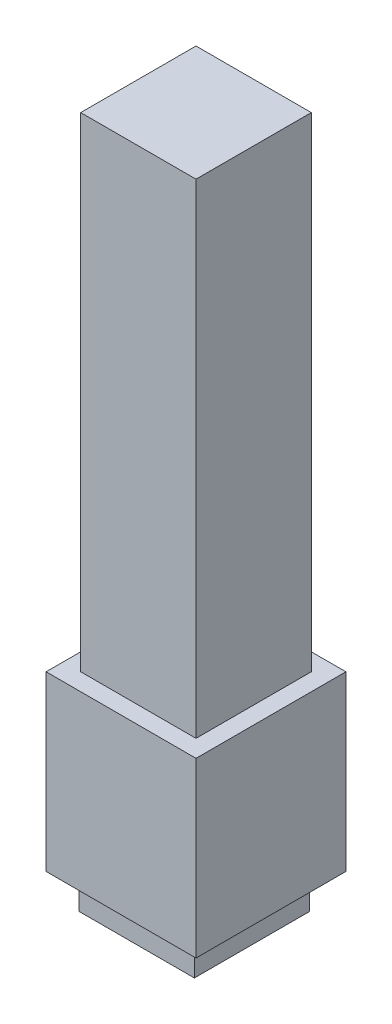
ISO-10303-21;
HEADER;
FILE_DESCRIPTION(('STEP AP214'),'2;1');
FILE_NAME('part.step','',(''),(''),'','','');
FILE_SCHEMA(('AUTOMOTIVE_DESIGN { 1 0 10303 214 1 1 1 1 }'));
ENDSEC;
DATA;
#1=APPLICATION_CONTEXT('core data for automotive mechanical design processes');
#2=APPLICATION_PROTOCOL_DEFINITION('international standard','automotive_design',2000,#1);
#3=PRODUCT_CONTEXT('',#1,'mechanical');
#4=PRODUCT('Part','Part','',(#3));
#5=PRODUCT_RELATED_PRODUCT_CATEGORY('part','',(#4));
#6=PRODUCT_DEFINITION_FORMATION('','',#4);
#7=PRODUCT_DEFINITION_CONTEXT('part definition',#1,'design');
#8=PRODUCT_DEFINITION('design','',#6,#7);
#9=PRODUCT_DEFINITION_SHAPE('','',#8);
#10=(LENGTH_UNIT() NAMED_UNIT(*) SI_UNIT(.MILLI.,.METRE.));
#11=(NAMED_UNIT(*) PLANE_ANGLE_UNIT() SI_UNIT($,.RADIAN.));
#12=(NAMED_UNIT(*) SI_UNIT($,.STERADIAN.) SOLID_ANGLE_UNIT());
#13=UNCERTAINTY_MEASURE_WITH_UNIT(LENGTH_MEASURE(1.E-05),#10,'distance_accuracy_value','');
#14=(GEOMETRIC_REPRESENTATION_CONTEXT(3) GLOBAL_UNCERTAINTY_ASSIGNED_CONTEXT((#13)) GLOBAL_UNIT_ASSIGNED_CONTEXT((#10,
#11,#12)) REPRESENTATION_CONTEXT('',''));
#15=CARTESIAN_POINT('',(0.,0.,0.));
#16=DIRECTION('',(0.,0.,1.));
#17=DIRECTION('',(1.,0.,0.));
#18=AXIS2_PLACEMENT_3D('',#15,#16,#17);
#19=CARTESIAN_POINT('',(0.,914.4,0.));
#20=DIRECTION('',(0.,-1.,0.));
#21=DIRECTION('',(0.,0.,-1.));
#22=AXIS2_PLACEMENT_3D('',#19,#20,#21);
#23=PLANE('',#22);
#24=DIRECTION('',(0.,0.,-1.));
#25=VECTOR('',#24,1.);
#26=CARTESIAN_POINT('',(587.791048245825,914.4,72.6089517541751));
#27=LINE('',#26,#25);
#28=CARTESIAN_POINT('',(587.791048245825,914.4,72.6089517541751));
#29=VERTEX_POINT('',#28);
#30=CARTESIAN_POINT('',(587.791048245825,914.4,-587.791048245825));
#31=VERTEX_POINT('',#30);
#32=EDGE_CURVE('E163',#29,#31,#27,.T.);
#33=ORIENTED_EDGE('',*,*,#32,.T.);
#34=DIRECTION('',(-1.,0.,0.));
#35=VECTOR('',#34,1.);
#36=CARTESIAN_POINT('',(-72.6089517541752,914.4,-587.791048245825));
#37=LINE('',#36,#35);
#38=CARTESIAN_POINT('',(-72.6089517541752,914.4,-587.791048245825));
#39=VERTEX_POINT('',#38);
#40=EDGE_CURVE('E167',#31,#39,#37,.T.);
#41=ORIENTED_EDGE('',*,*,#40,.T.);
#42=DIRECTION('',(0.,0.,1.));
#43=VECTOR('',#42,1.);
#44=CARTESIAN_POINT('',(-72.6089517541752,914.4,72.6089517541751));
#45=LINE('',#44,#43);
#46=CARTESIAN_POINT('',(-72.6089517541752,914.4,72.6089517541751));
#47=VERTEX_POINT('',#46);
#48=EDGE_CURVE('E171',#39,#47,#45,.T.);
#49=ORIENTED_EDGE('',*,*,#48,.T.);
#50=DIRECTION('',(1.,0.,0.));
#51=VECTOR('',#50,1.);
#52=CARTESIAN_POINT('',(-72.6089517541752,914.4,72.6089517541751));
#53=LINE('',#52,#51);
#54=EDGE_CURVE('E174',#47,#29,#53,.T.);
#55=ORIENTED_EDGE('',*,*,#54,.T.);
#56=EDGE_LOOP('',(#33,#41,#49,#55));
#57=FACE_BOUND('',#56,.T.);
#58=DIRECTION('',(0.,0.,-1.));
#59=VECTOR('',#58,1.);
#60=CARTESIAN_POINT('',(511.591048245825,914.4,-3.59104824582479));
#61=LINE('',#60,#59);
#62=CARTESIAN_POINT('',(511.591048245825,914.4,-3.59104824582479));
#63=VERTEX_POINT('',#62);
#64=CARTESIAN_POINT('',(511.591048245825,914.4,-511.591048245825));
#65=VERTEX_POINT('',#64);
#66=EDGE_CURVE('E55',#63,#65,#61,.T.);
#67=ORIENTED_EDGE('',*,*,#66,.F.);
#68=DIRECTION('',(1.,0.,0.));
#69=VECTOR('',#68,1.);
#70=CARTESIAN_POINT('',(3.59104824582479,914.4,-3.59104824582479));
#71=LINE('',#70,#69);
#72=CARTESIAN_POINT('',(3.59104824582479,914.4,-3.59104824582479));
#73=VERTEX_POINT('',#72);
#74=EDGE_CURVE('E59',#73,#63,#71,.T.);
#75=ORIENTED_EDGE('',*,*,#74,.F.);
#76=DIRECTION('',(0.,0.,1.));
#77=VECTOR('',#76,1.);
#78=CARTESIAN_POINT('',(3.59104824582479,914.4,-3.59104824582479));
#79=LINE('',#78,#77);
#80=CARTESIAN_POINT('',(3.59104824582479,914.4,-511.591048245825));
#81=VERTEX_POINT('',#80);
#82=EDGE_CURVE('E400',#81,#73,#79,.T.);
#83=ORIENTED_EDGE('',*,*,#82,.F.);
#84=DIRECTION('',(-1.,0.,0.));
#85=VECTOR('',#84,1.);
#86=CARTESIAN_POINT('',(3.59104824582479,914.4,-511.591048245825));
#87=LINE('',#86,#85);
#88=EDGE_CURVE('E410',#65,#81,#87,.T.);
#89=ORIENTED_EDGE('',*,*,#88,.F.);
#90=EDGE_LOOP('',(#67,#75,#83,#89));
#91=FACE_BOUND('',#90,.T.);
#92=ADVANCED_FACE('F39',(#57,#91),#23,.F.);
#93=CARTESIAN_POINT('',(0.,152.4,0.));
#94=DIRECTION('',(1.,0.,0.));
#95=DIRECTION('',(0.,0.,-1.));
#96=AXIS2_PLACEMENT_3D('',#93,#94,#95);
#97=PLANE('',#96);
#98=DIRECTION('',(0.,0.,1.));
#99=VECTOR('',#98,1.);
#100=CARTESIAN_POINT('',(0.,0.,0.));
#101=LINE('',#100,#99);
#102=CARTESIAN_POINT('',(0.,0.,-508.));
#103=VERTEX_POINT('',#102);
#104=CARTESIAN_POINT('',(0.,0.,0.));
#105=VERTEX_POINT('',#104);
#106=EDGE_CURVE('E200',#103,#105,#101,.T.);
#107=ORIENTED_EDGE('',*,*,#106,.T.);
#108=DIRECTION('',(0.,-1.,0.));
#109=VECTOR('',#108,1.);
#110=CARTESIAN_POINT('',(0.,152.4,0.));
#111=LINE('',#110,#109);
#112=CARTESIAN_POINT('',(0.,152.4,0.));
#113=VERTEX_POINT('',#112);
#114=EDGE_CURVE('E11',#113,#105,#111,.T.);
#115=ORIENTED_EDGE('',*,*,#114,.F.);
#116=DIRECTION('',(0.,0.,1.));
#117=VECTOR('',#116,1.);
#118=CARTESIAN_POINT('',(0.,152.4,0.));
#119=LINE('',#118,#117);
#120=CARTESIAN_POINT('',(0.,152.4,-508.));
#121=VERTEX_POINT('',#120);
#122=EDGE_CURVE('E201',#121,#113,#119,.T.);
#123=ORIENTED_EDGE('',*,*,#122,.F.);
#124=DIRECTION('',(0.,-1.,0.));
#125=VECTOR('',#124,1.);
#126=CARTESIAN_POINT('',(0.,152.4,-508.));
#127=LINE('',#126,#125);
#128=EDGE_CURVE('E218',#121,#103,#127,.T.);
#129=ORIENTED_EDGE('',*,*,#128,.T.);
#130=EDGE_LOOP('',(#107,#115,#123,#129));
#131=FACE_BOUND('',#130,.T.);
#132=ADVANCED_FACE('F41',(#131),#97,.F.);
#133=CARTESIAN_POINT('',(0.,152.4,0.));
#134=DIRECTION('',(0.,0.,-1.));
#135=DIRECTION('',(-1.,0.,0.));
#136=AXIS2_PLACEMENT_3D('',#133,#134,#135);
#137=PLANE('',#136);
#138=DIRECTION('',(1.,0.,0.));
#139=VECTOR('',#138,1.);
#140=CARTESIAN_POINT('',(0.,0.,0.));
#141=LINE('',#140,#139);
#142=CARTESIAN_POINT('',(508.,0.,0.));
#143=VERTEX_POINT('',#142);
#144=EDGE_CURVE('E222',#105,#143,#141,.T.);
#145=ORIENTED_EDGE('',*,*,#144,.T.);
#146=DIRECTION('',(0.,-1.,0.));
#147=VECTOR('',#146,1.);
#148=CARTESIAN_POINT('',(508.,152.4,0.));
#149=LINE('',#148,#147);
#150=CARTESIAN_POINT('',(508.,152.4,0.));
#151=VERTEX_POINT('',#150);
#152=EDGE_CURVE('E48',#151,#143,#149,.T.);
#153=ORIENTED_EDGE('',*,*,#152,.F.);
#154=DIRECTION('',(1.,0.,0.));
#155=VECTOR('',#154,1.);
#156=CARTESIAN_POINT('',(0.,152.4,0.));
#157=LINE('',#156,#155);
#158=EDGE_CURVE('E205',#113,#151,#157,.T.);
#159=ORIENTED_EDGE('',*,*,#158,.F.);
#160=ORIENTED_EDGE('',*,*,#114,.T.);
#161=EDGE_LOOP('',(#145,#153,#159,#160));
#162=FACE_BOUND('',#161,.T.);
#163=ADVANCED_FACE('F256',(#162),#137,.F.);
#164=CARTESIAN_POINT('',(508.,152.4,0.));
#165=DIRECTION('',(-1.,0.,0.));
#166=DIRECTION('',(0.,0.,1.));
#167=AXIS2_PLACEMENT_3D('',#164,#165,#166);
#168=PLANE('',#167);
#169=DIRECTION('',(0.,0.,-1.));
#170=VECTOR('',#169,1.);
#171=CARTESIAN_POINT('',(508.,0.,0.));
#172=LINE('',#171,#170);
#173=CARTESIAN_POINT('',(508.,0.,-508.));
#174=VERTEX_POINT('',#173);
#175=EDGE_CURVE('E225',#143,#174,#172,.T.);
#176=ORIENTED_EDGE('',*,*,#175,.T.);
#177=DIRECTION('',(0.,-1.,0.));
#178=VECTOR('',#177,1.);
#179=CARTESIAN_POINT('',(508.,152.4,-508.));
#180=LINE('',#179,#178);
#181=CARTESIAN_POINT('',(508.,152.4,-508.));
#182=VERTEX_POINT('',#181);
#183=EDGE_CURVE('E233',#182,#174,#180,.T.);
#184=ORIENTED_EDGE('',*,*,#183,.F.);
#185=DIRECTION('',(0.,0.,-1.));
#186=VECTOR('',#185,1.);
#187=CARTESIAN_POINT('',(508.,152.4,0.));
#188=LINE('',#187,#186);
#189=EDGE_CURVE('E210',#151,#182,#188,.T.);
#190=ORIENTED_EDGE('',*,*,#189,.F.);
#191=ORIENTED_EDGE('',*,*,#152,.T.);
#192=EDGE_LOOP('',(#176,#184,#190,#191));
#193=FACE_BOUND('',#192,.T.);
#194=ADVANCED_FACE('F241',(#193),#168,.F.);
#195=CARTESIAN_POINT('',(0.,152.4,-508.));
#196=DIRECTION('',(0.,0.,1.));
#197=DIRECTION('',(1.,0.,0.));
#198=AXIS2_PLACEMENT_3D('',#195,#196,#197);
#199=PLANE('',#198);
#200=DIRECTION('',(-1.,0.,0.));
#201=VECTOR('',#200,1.);
#202=CARTESIAN_POINT('',(0.,0.,-508.));
#203=LINE('',#202,#201);
#204=EDGE_CURVE('E206',#174,#103,#203,.T.);
#205=ORIENTED_EDGE('',*,*,#204,.T.);
#206=ORIENTED_EDGE('',*,*,#128,.F.);
#207=DIRECTION('',(-1.,0.,0.));
#208=VECTOR('',#207,1.);
#209=CARTESIAN_POINT('',(0.,152.4,-508.));
#210=LINE('',#209,#208);
#211=EDGE_CURVE('E214',#182,#121,#210,.T.);
#212=ORIENTED_EDGE('',*,*,#211,.F.);
#213=ORIENTED_EDGE('',*,*,#183,.T.);
#214=EDGE_LOOP('',(#205,#206,#212,#213));
#215=FACE_BOUND('',#214,.T.);
#216=ADVANCED_FACE('F249',(#215),#199,.F.);
#217=CARTESIAN_POINT('',(0.,0.,0.));
#218=DIRECTION('',(0.,-1.,0.));
#219=DIRECTION('',(0.,0.,-1.));
#220=AXIS2_PLACEMENT_3D('',#217,#218,#219);
#221=PLANE('',#220);
#222=ORIENTED_EDGE('',*,*,#106,.F.);
#223=ORIENTED_EDGE('',*,*,#204,.F.);
#224=ORIENTED_EDGE('',*,*,#175,.F.);
#225=ORIENTED_EDGE('',*,*,#144,.F.);
#226=EDGE_LOOP('',(#222,#223,#224,#225));
#227=FACE_BOUND('',#226,.T.);
#228=ADVANCED_FACE('F246',(#227),#221,.T.);
#229=CARTESIAN_POINT('',(587.791048245825,914.4,72.6089517541751));
#230=DIRECTION('',(-1.,0.,0.));
#231=DIRECTION('',(0.,0.,1.));
#232=AXIS2_PLACEMENT_3D('',#229,#230,#231);
#233=PLANE('',#232);
#234=DIRECTION('',(0.,0.,-1.));
#235=VECTOR('',#234,1.);
#236=CARTESIAN_POINT('',(587.791048245825,152.4,72.6089517541751));
#237=LINE('',#236,#235);
#238=CARTESIAN_POINT('',(587.791048245825,152.4,72.6089517541751));
#239=VERTEX_POINT('',#238);
#240=CARTESIAN_POINT('',(587.791048245825,152.4,-587.791048245825));
#241=VERTEX_POINT('',#240);
#242=EDGE_CURVE('E152',#239,#241,#237,.T.);
#243=ORIENTED_EDGE('',*,*,#242,.T.);
#244=DIRECTION('',(0.,-1.,0.));
#245=VECTOR('',#244,1.);
#246=CARTESIAN_POINT('',(587.791048245825,914.4,-587.791048245825));
#247=LINE('',#246,#245);
#248=EDGE_CURVE('E196',#31,#241,#247,.T.);
#249=ORIENTED_EDGE('',*,*,#248,.F.);
#250=ORIENTED_EDGE('',*,*,#32,.F.);
#251=DIRECTION('',(0.,-1.,0.));
#252=VECTOR('',#251,1.);
#253=CARTESIAN_POINT('',(587.791048245825,914.4,72.6089517541751));
#254=LINE('',#253,#252);
#255=EDGE_CURVE('E176',#29,#239,#254,.T.);
#256=ORIENTED_EDGE('',*,*,#255,.T.);
#257=EDGE_LOOP('',(#243,#249,#250,#256));
#258=FACE_BOUND('',#257,.T.);
#259=ADVANCED_FACE('F284',(#258),#233,.F.);
#260=CARTESIAN_POINT('',(-72.6089517541752,914.4,-587.791048245825));
#261=DIRECTION('',(0.,0.,1.));
#262=DIRECTION('',(1.,0.,0.));
#263=AXIS2_PLACEMENT_3D('',#260,#261,#262);
#264=PLANE('',#263);
#265=DIRECTION('',(-1.,0.,0.));
#266=VECTOR('',#265,1.);
#267=CARTESIAN_POINT('',(-72.6089517541752,152.4,-587.791048245825));
#268=LINE('',#267,#266);
#269=CARTESIAN_POINT('',(-72.6089517541752,152.4,-587.791048245825));
#270=VERTEX_POINT('',#269);
#271=EDGE_CURVE('E157',#241,#270,#268,.T.);
#272=ORIENTED_EDGE('',*,*,#271,.T.);
#273=DIRECTION('',(0.,-1.,0.));
#274=VECTOR('',#273,1.);
#275=CARTESIAN_POINT('',(-72.6089517541752,914.4,-587.791048245825));
#276=LINE('',#275,#274);
#277=EDGE_CURVE('E192',#39,#270,#276,.T.);
#278=ORIENTED_EDGE('',*,*,#277,.F.);
#279=ORIENTED_EDGE('',*,*,#40,.F.);
#280=ORIENTED_EDGE('',*,*,#248,.T.);
#281=EDGE_LOOP('',(#272,#278,#279,#280));
#282=FACE_BOUND('',#281,.T.);
#283=ADVANCED_FACE('F280',(#282),#264,.F.);
#284=CARTESIAN_POINT('',(-72.6089517541752,914.4,72.6089517541751));
#285=DIRECTION('',(1.,0.,0.));
#286=DIRECTION('',(0.,0.,-1.));
#287=AXIS2_PLACEMENT_3D('',#284,#285,#286);
#288=PLANE('',#287);
#289=DIRECTION('',(0.,0.,1.));
#290=VECTOR('',#289,1.);
#291=CARTESIAN_POINT('',(-72.6089517541752,152.4,72.6089517541751));
#292=LINE('',#291,#290);
#293=CARTESIAN_POINT('',(-72.6089517541752,152.4,72.6089517541751));
#294=VERTEX_POINT('',#293);
#295=EDGE_CURVE('E180',#270,#294,#292,.T.);
#296=ORIENTED_EDGE('',*,*,#295,.T.);
#297=DIRECTION('',(0.,-1.,0.));
#298=VECTOR('',#297,1.);
#299=CARTESIAN_POINT('',(-72.6089517541752,914.4,72.6089517541751));
#300=LINE('',#299,#298);
#301=EDGE_CURVE('E188',#47,#294,#300,.T.);
#302=ORIENTED_EDGE('',*,*,#301,.F.);
#303=ORIENTED_EDGE('',*,*,#48,.F.);
#304=ORIENTED_EDGE('',*,*,#277,.T.);
#305=EDGE_LOOP('',(#296,#302,#303,#304));
#306=FACE_BOUND('',#305,.T.);
#307=ADVANCED_FACE('F276',(#306),#288,.F.);
#308=CARTESIAN_POINT('',(-72.6089517541752,914.4,72.6089517541751));
#309=DIRECTION('',(0.,0.,-1.));
#310=DIRECTION('',(-1.,0.,0.));
#311=AXIS2_PLACEMENT_3D('',#308,#309,#310);
#312=PLANE('',#311);
#313=DIRECTION('',(1.,0.,0.));
#314=VECTOR('',#313,1.);
#315=CARTESIAN_POINT('',(-72.6089517541752,152.4,72.6089517541751));
#316=LINE('',#315,#314);
#317=EDGE_CURVE('E168',#294,#239,#316,.T.);
#318=ORIENTED_EDGE('',*,*,#317,.T.);
#319=ORIENTED_EDGE('',*,*,#255,.F.);
#320=ORIENTED_EDGE('',*,*,#54,.F.);
#321=ORIENTED_EDGE('',*,*,#301,.T.);
#322=EDGE_LOOP('',(#318,#319,#320,#321));
#323=FACE_BOUND('',#322,.T.);
#324=ADVANCED_FACE('F273',(#323),#312,.F.);
#325=CARTESIAN_POINT('',(0.,152.4,0.));
#326=DIRECTION('',(0.,-1.,0.));
#327=DIRECTION('',(0.,0.,-1.));
#328=AXIS2_PLACEMENT_3D('',#325,#326,#327);
#329=PLANE('',#328);
#330=ORIENTED_EDGE('',*,*,#211,.T.);
#331=ORIENTED_EDGE('',*,*,#122,.T.);
#332=ORIENTED_EDGE('',*,*,#158,.T.);
#333=ORIENTED_EDGE('',*,*,#189,.T.);
#334=EDGE_LOOP('',(#330,#331,#332,#333));
#335=FACE_BOUND('',#334,.T.);
#336=ORIENTED_EDGE('',*,*,#242,.F.);
#337=ORIENTED_EDGE('',*,*,#317,.F.);
#338=ORIENTED_EDGE('',*,*,#295,.F.);
#339=ORIENTED_EDGE('',*,*,#271,.F.);
#340=EDGE_LOOP('',(#336,#337,#338,#339));
#341=FACE_BOUND('',#340,.T.);
#342=ADVANCED_FACE('F254',(#335,#341),#329,.T.);
#343=CARTESIAN_POINT('',(511.591048245825,3048.,-3.59104824582479));
#344=DIRECTION('',(-1.,0.,0.));
#345=DIRECTION('',(0.,0.,1.));
#346=AXIS2_PLACEMENT_3D('',#343,#344,#345);
#347=PLANE('',#346);
#348=ORIENTED_EDGE('',*,*,#66,.T.);
#349=DIRECTION('',(0.,-1.,0.));
#350=VECTOR('',#349,1.);
#351=CARTESIAN_POINT('',(511.591048245825,3048.,-511.591048245825));
#352=LINE('',#351,#350);
#353=CARTESIAN_POINT('',(511.591048245825,3048.,-511.591048245825));
#354=VERTEX_POINT('',#353);
#355=EDGE_CURVE('E132',#354,#65,#352,.T.);
#356=ORIENTED_EDGE('',*,*,#355,.F.);
#357=DIRECTION('',(0.,0.,-1.));
#358=VECTOR('',#357,1.);
#359=CARTESIAN_POINT('',(511.591048245825,3048.,-3.59104824582479));
#360=LINE('',#359,#358);
#361=CARTESIAN_POINT('',(511.591048245825,3048.,-3.59104824582479));
#362=VERTEX_POINT('',#361);
#363=EDGE_CURVE('E139',#362,#354,#360,.T.);
#364=ORIENTED_EDGE('',*,*,#363,.F.);
#365=DIRECTION('',(0.,-1.,0.));
#366=VECTOR('',#365,1.);
#367=CARTESIAN_POINT('',(511.591048245825,3048.,-3.59104824582479));
#368=LINE('',#367,#366);
#369=EDGE_CURVE('E397',#362,#63,#368,.T.);
#370=ORIENTED_EDGE('',*,*,#369,.T.);
#371=EDGE_LOOP('',(#348,#356,#364,#370));
#372=FACE_BOUND('',#371,.T.);
#373=ADVANCED_FACE('F150',(#372),#347,.F.);
#374=CARTESIAN_POINT('',(3.59104824582479,3048.,-511.591048245825));
#375=DIRECTION('',(0.,0.,1.));
#376=DIRECTION('',(1.,0.,0.));
#377=AXIS2_PLACEMENT_3D('',#374,#375,#376);
#378=PLANE('',#377);
#379=ORIENTED_EDGE('',*,*,#88,.T.);
#380=DIRECTION('',(0.,-1.,0.));
#381=VECTOR('',#380,1.);
#382=CARTESIAN_POINT('',(3.59104824582479,3048.,-511.591048245825));
#383=LINE('',#382,#381);
#384=CARTESIAN_POINT('',(3.59104824582479,3048.,-511.591048245825));
#385=VERTEX_POINT('',#384);
#386=EDGE_CURVE('E134',#385,#81,#383,.T.);
#387=ORIENTED_EDGE('',*,*,#386,.F.);
#388=DIRECTION('',(-1.,0.,0.));
#389=VECTOR('',#388,1.);
#390=CARTESIAN_POINT('',(3.59104824582479,3048.,-511.591048245825));
#391=LINE('',#390,#389);
#392=EDGE_CURVE('E127',#354,#385,#391,.T.);
#393=ORIENTED_EDGE('',*,*,#392,.F.);
#394=ORIENTED_EDGE('',*,*,#355,.T.);
#395=EDGE_LOOP('',(#379,#387,#393,#394));
#396=FACE_BOUND('',#395,.T.);
#397=ADVANCED_FACE('F130',(#396),#378,.F.);
#398=CARTESIAN_POINT('',(3.59104824582479,3048.,-3.59104824582479));
#399=DIRECTION('',(1.,0.,0.));
#400=DIRECTION('',(0.,0.,-1.));
#401=AXIS2_PLACEMENT_3D('',#398,#399,#400);
#402=PLANE('',#401);
#403=ORIENTED_EDGE('',*,*,#82,.T.);
#404=DIRECTION('',(0.,-1.,0.));
#405=VECTOR('',#404,1.);
#406=CARTESIAN_POINT('',(3.59104824582479,3048.,-3.59104824582479));
#407=LINE('',#406,#405);
#408=CARTESIAN_POINT('',(3.59104824582479,3048.,-3.59104824582479));
#409=VERTEX_POINT('',#408);
#410=EDGE_CURVE('E159',#409,#73,#407,.T.);
#411=ORIENTED_EDGE('',*,*,#410,.F.);
#412=DIRECTION('',(0.,0.,1.));
#413=VECTOR('',#412,1.);
#414=CARTESIAN_POINT('',(3.59104824582479,3048.,-3.59104824582479));
#415=LINE('',#414,#413);
#416=EDGE_CURVE('E138',#385,#409,#415,.T.);
#417=ORIENTED_EDGE('',*,*,#416,.F.);
#418=ORIENTED_EDGE('',*,*,#386,.T.);
#419=EDGE_LOOP('',(#403,#411,#417,#418));
#420=FACE_BOUND('',#419,.T.);
#421=ADVANCED_FACE('F332',(#420),#402,.F.);
#422=CARTESIAN_POINT('',(3.59104824582479,3048.,-3.59104824582479));
#423=DIRECTION('',(0.,0.,-1.));
#424=DIRECTION('',(-1.,0.,0.));
#425=AXIS2_PLACEMENT_3D('',#422,#423,#424);
#426=PLANE('',#425);
#427=ORIENTED_EDGE('',*,*,#74,.T.);
#428=ORIENTED_EDGE('',*,*,#369,.F.);
#429=DIRECTION('',(1.,0.,0.));
#430=VECTOR('',#429,1.);
#431=CARTESIAN_POINT('',(3.59104824582479,3048.,-3.59104824582479));
#432=LINE('',#431,#430);
#433=EDGE_CURVE('E144',#409,#362,#432,.T.);
#434=ORIENTED_EDGE('',*,*,#433,.F.);
#435=ORIENTED_EDGE('',*,*,#410,.T.);
#436=EDGE_LOOP('',(#427,#428,#434,#435));
#437=FACE_BOUND('',#436,.T.);
#438=ADVANCED_FACE('F338',(#437),#426,.F.);
#439=CARTESIAN_POINT('',(0.,3048.,0.));
#440=DIRECTION('',(0.,-1.,0.));
#441=DIRECTION('',(0.,0.,-1.));
#442=AXIS2_PLACEMENT_3D('',#439,#440,#441);
#443=PLANE('',#442);
#444=ORIENTED_EDGE('',*,*,#363,.T.);
#445=ORIENTED_EDGE('',*,*,#392,.T.);
#446=ORIENTED_EDGE('',*,*,#416,.T.);
#447=ORIENTED_EDGE('',*,*,#433,.T.);
#448=EDGE_LOOP('',(#444,#445,#446,#447));
#449=FACE_BOUND('',#448,.T.);
#450=ADVANCED_FACE('F142',(#449),#443,.F.);
#451=CLOSED_SHELL('',(#92,#132,#163,#194,#216,#228,#259,#283,#307,#324,#342,#373,#397,#421,#438,#450));
#452=MANIFOLD_SOLID_BREP('B2',#451);
#453=ADVANCED_BREP_SHAPE_REPRESENTATION('',(#18,#452),#14);
#454=SHAPE_DEFINITION_REPRESENTATION(#9,#453);
ENDSEC;
END-ISO-10303-21;
